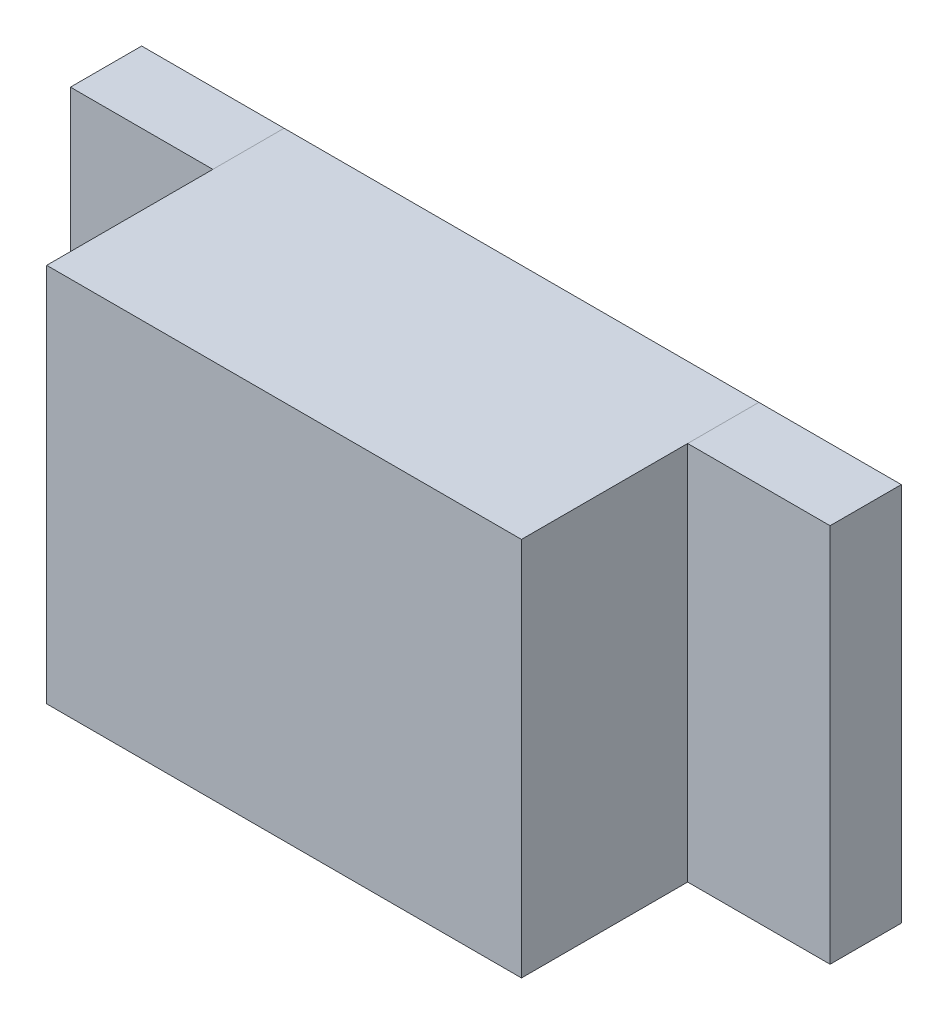
ISO-10303-21;
HEADER;
FILE_DESCRIPTION(('STEP AP214'),'2;1');
FILE_NAME('part.step','',(''),(''),'','','');
FILE_SCHEMA(('AUTOMOTIVE_DESIGN { 1 0 10303 214 1 1 1 1 }'));
ENDSEC;
DATA;
#1=APPLICATION_CONTEXT('core data for automotive mechanical design processes');
#2=APPLICATION_PROTOCOL_DEFINITION('international standard','automotive_design',2000,#1);
#3=PRODUCT_CONTEXT('',#1,'mechanical');
#4=PRODUCT('Part','Part','',(#3));
#5=PRODUCT_RELATED_PRODUCT_CATEGORY('part','',(#4));
#6=PRODUCT_DEFINITION_FORMATION('','',#4);
#7=PRODUCT_DEFINITION_CONTEXT('part definition',#1,'design');
#8=PRODUCT_DEFINITION('design','',#6,#7);
#9=PRODUCT_DEFINITION_SHAPE('','',#8);
#10=(LENGTH_UNIT() NAMED_UNIT(*) SI_UNIT(.MILLI.,.METRE.));
#11=(NAMED_UNIT(*) PLANE_ANGLE_UNIT() SI_UNIT($,.RADIAN.));
#12=(NAMED_UNIT(*) SI_UNIT($,.STERADIAN.) SOLID_ANGLE_UNIT());
#13=UNCERTAINTY_MEASURE_WITH_UNIT(LENGTH_MEASURE(1.E-05),#10,'distance_accuracy_value','');
#14=(GEOMETRIC_REPRESENTATION_CONTEXT(3) GLOBAL_UNCERTAINTY_ASSIGNED_CONTEXT((#13)) GLOBAL_UNIT_ASSIGNED_CONTEXT((#10,
#11,#12)) REPRESENTATION_CONTEXT('',''));
#15=CARTESIAN_POINT('',(0.,0.,0.));
#16=DIRECTION('',(0.,0.,1.));
#17=DIRECTION('',(1.,0.,0.));
#18=AXIS2_PLACEMENT_3D('',#15,#16,#17);
#19=CARTESIAN_POINT('',(0.80000094,-0.3999992,0.));
#20=DIRECTION('',(0.,-1.,0.));
#21=DIRECTION('',(-1.,0.,0.));
#22=AXIS2_PLACEMENT_3D('',#19,#20,#21);
#23=PLANE('',#22);
#24=DIRECTION('',(0.,0.,1.));
#25=VECTOR('',#24,1.);
#26=CARTESIAN_POINT('',(0.80000094,-0.3999992,0.));
#27=LINE('',#26,#25);
#28=CARTESIAN_POINT('',(0.80000094,-0.3999992,0.));
#29=VERTEX_POINT('',#28);
#30=CARTESIAN_POINT('',(0.80000094,-0.3999992,0.1499997));
#31=VERTEX_POINT('',#30);
#32=EDGE_CURVE('P0_E10',#29,#31,#27,.T.);
#33=ORIENTED_EDGE('',*,*,#32,.T.);
#34=DIRECTION('',(-1.,0.,0.));
#35=VECTOR('',#34,1.);
#36=CARTESIAN_POINT('',(0.80000094,-0.3999992,0.1499997));
#37=LINE('',#36,#35);
#38=CARTESIAN_POINT('',(-0.80000094,-0.3999992,0.1499997));
#39=VERTEX_POINT('',#38);
#40=EDGE_CURVE('P0_E23',#31,#39,#37,.T.);
#41=ORIENTED_EDGE('',*,*,#40,.T.);
#42=DIRECTION('',(0.,0.,1.));
#43=VECTOR('',#42,1.);
#44=CARTESIAN_POINT('',(-0.80000094,-0.3999992,0.));
#45=LINE('',#44,#43);
#46=CARTESIAN_POINT('',(-0.80000094,-0.3999992,0.));
#47=VERTEX_POINT('',#46);
#48=EDGE_CURVE('P0_E84',#47,#39,#45,.T.);
#49=ORIENTED_EDGE('',*,*,#48,.F.);
#50=DIRECTION('',(-1.,0.,0.));
#51=VECTOR('',#50,1.);
#52=CARTESIAN_POINT('',(0.80000094,-0.3999992,0.));
#53=LINE('',#52,#51);
#54=EDGE_CURVE('P0_E82',#29,#47,#53,.T.);
#55=ORIENTED_EDGE('',*,*,#54,.F.);
#56=EDGE_LOOP('',(#33,#41,#49,#55));
#57=FACE_BOUND('',#56,.T.);
#58=ADVANCED_FACE('P0_F16',(#57),#23,.T.);
#59=CARTESIAN_POINT('',(-0.80000094,-0.3999992,0.));
#60=DIRECTION('',(-1.,0.,0.));
#61=DIRECTION('',(0.,1.,0.));
#62=AXIS2_PLACEMENT_3D('',#59,#60,#61);
#63=PLANE('',#62);
#64=ORIENTED_EDGE('',*,*,#48,.T.);
#65=DIRECTION('',(0.,1.,0.));
#66=VECTOR('',#65,1.);
#67=CARTESIAN_POINT('',(-0.80000094,-0.3999992,0.1499997));
#68=LINE('',#67,#66);
#69=CARTESIAN_POINT('',(-0.80000094,0.3999992,0.1499997));
#70=VERTEX_POINT('',#69);
#71=EDGE_CURVE('P0_E80',#39,#70,#68,.T.);
#72=ORIENTED_EDGE('',*,*,#71,.T.);
#73=DIRECTION('',(0.,0.,1.));
#74=VECTOR('',#73,1.);
#75=CARTESIAN_POINT('',(-0.80000094,0.3999992,0.));
#76=LINE('',#75,#74);
#77=CARTESIAN_POINT('',(-0.80000094,0.3999992,0.));
#78=VERTEX_POINT('',#77);
#79=EDGE_CURVE('P0_E78',#78,#70,#76,.T.);
#80=ORIENTED_EDGE('',*,*,#79,.F.);
#81=DIRECTION('',(0.,1.,0.));
#82=VECTOR('',#81,1.);
#83=CARTESIAN_POINT('',(-0.80000094,-0.3999992,0.));
#84=LINE('',#83,#82);
#85=EDGE_CURVE('P0_E69',#47,#78,#84,.T.);
#86=ORIENTED_EDGE('',*,*,#85,.F.);
#87=EDGE_LOOP('',(#64,#72,#80,#86));
#88=FACE_BOUND('',#87,.T.);
#89=ADVANCED_FACE('P0_F89',(#88),#63,.T.);
#90=CARTESIAN_POINT('',(-0.80000094,0.3999992,0.));
#91=DIRECTION('',(0.,1.,0.));
#92=DIRECTION('',(1.,0.,0.));
#93=AXIS2_PLACEMENT_3D('',#90,#91,#92);
#94=PLANE('',#93);
#95=ORIENTED_EDGE('',*,*,#79,.T.);
#96=DIRECTION('',(1.,0.,0.));
#97=VECTOR('',#96,1.);
#98=CARTESIAN_POINT('',(-0.80000094,0.3999992,0.1499997));
#99=LINE('',#98,#97);
#100=CARTESIAN_POINT('',(0.80000094,0.3999992,0.1499997));
#101=VERTEX_POINT('',#100);
#102=EDGE_CURVE('P0_E59',#70,#101,#99,.T.);
#103=ORIENTED_EDGE('',*,*,#102,.T.);
#104=DIRECTION('',(0.,0.,1.));
#105=VECTOR('',#104,1.);
#106=CARTESIAN_POINT('',(0.80000094,0.3999992,0.));
#107=LINE('',#106,#105);
#108=CARTESIAN_POINT('',(0.80000094,0.3999992,0.));
#109=VERTEX_POINT('',#108);
#110=EDGE_CURVE('P0_E53',#109,#101,#107,.T.);
#111=ORIENTED_EDGE('',*,*,#110,.F.);
#112=DIRECTION('',(1.,0.,0.));
#113=VECTOR('',#112,1.);
#114=CARTESIAN_POINT('',(-0.80000094,0.3999992,0.));
#115=LINE('',#114,#113);
#116=EDGE_CURVE('P0_E57',#78,#109,#115,.T.);
#117=ORIENTED_EDGE('',*,*,#116,.F.);
#118=EDGE_LOOP('',(#95,#103,#111,#117));
#119=FACE_BOUND('',#118,.T.);
#120=ADVANCED_FACE('P0_F56',(#119),#94,.T.);
#121=CARTESIAN_POINT('',(0.80000094,0.3999992,0.));
#122=DIRECTION('',(1.,0.,0.));
#123=DIRECTION('',(0.,-1.,0.));
#124=AXIS2_PLACEMENT_3D('',#121,#122,#123);
#125=PLANE('',#124);
#126=ORIENTED_EDGE('',*,*,#110,.T.);
#127=DIRECTION('',(0.,-1.,0.));
#128=VECTOR('',#127,1.);
#129=CARTESIAN_POINT('',(0.80000094,0.3999992,0.1499997));
#130=LINE('',#129,#128);
#131=EDGE_CURVE('P0_E70',#101,#31,#130,.T.);
#132=ORIENTED_EDGE('',*,*,#131,.T.);
#133=ORIENTED_EDGE('',*,*,#32,.F.);
#134=DIRECTION('',(0.,-1.,0.));
#135=VECTOR('',#134,1.);
#136=CARTESIAN_POINT('',(0.80000094,0.3999992,0.));
#137=LINE('',#136,#135);
#138=EDGE_CURVE('P0_E67',#109,#29,#137,.T.);
#139=ORIENTED_EDGE('',*,*,#138,.F.);
#140=EDGE_LOOP('',(#126,#132,#133,#139));
#141=FACE_BOUND('',#140,.T.);
#142=ADVANCED_FACE('P0_F72',(#141),#125,.T.);
#143=CARTESIAN_POINT('',(0.,0.,0.));
#144=DIRECTION('',(0.,0.,-1.));
#145=DIRECTION('',(0.,1.,0.));
#146=AXIS2_PLACEMENT_3D('',#143,#144,#145);
#147=PLANE('',#146);
#148=ORIENTED_EDGE('',*,*,#54,.T.);
#149=ORIENTED_EDGE('',*,*,#85,.T.);
#150=ORIENTED_EDGE('',*,*,#116,.T.);
#151=ORIENTED_EDGE('',*,*,#138,.T.);
#152=EDGE_LOOP('',(#148,#149,#150,#151));
#153=FACE_BOUND('',#152,.T.);
#154=ADVANCED_FACE('P0_F66',(#153),#147,.T.);
#155=CARTESIAN_POINT('',(0.,0.,0.1499997));
#156=DIRECTION('',(0.,0.,-1.));
#157=DIRECTION('',(0.,1.,0.));
#158=AXIS2_PLACEMENT_3D('',#155,#156,#157);
#159=PLANE('',#158);
#160=ORIENTED_EDGE('',*,*,#131,.F.);
#161=ORIENTED_EDGE('',*,*,#102,.F.);
#162=ORIENTED_EDGE('',*,*,#71,.F.);
#163=ORIENTED_EDGE('',*,*,#40,.F.);
#164=EDGE_LOOP('',(#160,#161,#162,#163));
#165=FACE_BOUND('',#164,.T.);
#166=ADVANCED_FACE('P0_F90',(#165),#159,.F.);
#167=CLOSED_SHELL('',(#58,#89,#120,#142,#154,#166));
#168=MANIFOLD_SOLID_BREP('P0_B1',#167);
#169=CARTESIAN_POINT('',(0.499999,0.3999992,0.));
#170=DIRECTION('',(0.,-1.,0.));
#171=DIRECTION('',(-1.,0.,0.));
#172=AXIS2_PLACEMENT_3D('',#169,#170,#171);
#173=PLANE('',#172);
#174=DIRECTION('',(-1.,0.,0.));
#175=VECTOR('',#174,1.);
#176=CARTESIAN_POINT('',(0.499999,0.3999992,0.));
#177=LINE('',#176,#175);
#178=CARTESIAN_POINT('',(0.499999,0.3999992,0.));
#179=VERTEX_POINT('',#178);
#180=CARTESIAN_POINT('',(-0.499999,0.3999992,0.));
#181=VERTEX_POINT('',#180);
#182=EDGE_CURVE('P1_E10',#179,#181,#177,.T.);
#183=ORIENTED_EDGE('',*,*,#182,.T.);
#184=DIRECTION('',(0.,0.,1.));
#185=VECTOR('',#184,1.);
#186=CARTESIAN_POINT('',(-0.499999,0.3999992,0.));
#187=LINE('',#186,#185);
#188=CARTESIAN_POINT('',(-0.499999,0.3999992,0.499999));
#189=VERTEX_POINT('',#188);
#190=EDGE_CURVE('P1_E23',#181,#189,#187,.T.);
#191=ORIENTED_EDGE('',*,*,#190,.T.);
#192=DIRECTION('',(-1.,0.,0.));
#193=VECTOR('',#192,1.);
#194=CARTESIAN_POINT('',(0.499999,0.3999992,0.499999));
#195=LINE('',#194,#193);
#196=CARTESIAN_POINT('',(0.499999,0.3999992,0.499999));
#197=VERTEX_POINT('',#196);
#198=EDGE_CURVE('P1_E86',#197,#189,#195,.T.);
#199=ORIENTED_EDGE('',*,*,#198,.F.);
#200=DIRECTION('',(0.,0.,1.));
#201=VECTOR('',#200,1.);
#202=CARTESIAN_POINT('',(0.499999,0.3999992,0.));
#203=LINE('',#202,#201);
#204=EDGE_CURVE('P1_E35',#179,#197,#203,.T.);
#205=ORIENTED_EDGE('',*,*,#204,.F.);
#206=EDGE_LOOP('',(#183,#191,#199,#205));
#207=FACE_BOUND('',#206,.T.);
#208=ADVANCED_FACE('P1_F16',(#207),#173,.F.);
#209=CARTESIAN_POINT('',(-0.499999,0.3999992,0.));
#210=DIRECTION('',(1.,0.,0.));
#211=DIRECTION('',(0.,-1.,0.));
#212=AXIS2_PLACEMENT_3D('',#209,#210,#211);
#213=PLANE('',#212);
#214=DIRECTION('',(0.,-1.,0.));
#215=VECTOR('',#214,1.);
#216=CARTESIAN_POINT('',(-0.499999,0.3999992,0.));
#217=LINE('',#216,#215);
#218=CARTESIAN_POINT('',(-0.499999,-0.3999992,0.));
#219=VERTEX_POINT('',#218);
#220=EDGE_CURVE('P1_E83',#181,#219,#217,.T.);
#221=ORIENTED_EDGE('',*,*,#220,.T.);
#222=DIRECTION('',(0.,0.,1.));
#223=VECTOR('',#222,1.);
#224=CARTESIAN_POINT('',(-0.499999,-0.3999992,0.));
#225=LINE('',#224,#223);
#226=CARTESIAN_POINT('',(-0.499999,-0.3999992,0.499999));
#227=VERTEX_POINT('',#226);
#228=EDGE_CURVE('P1_E81',#219,#227,#225,.T.);
#229=ORIENTED_EDGE('',*,*,#228,.T.);
#230=DIRECTION('',(0.,-1.,0.));
#231=VECTOR('',#230,1.);
#232=CARTESIAN_POINT('',(-0.499999,0.3999992,0.499999));
#233=LINE('',#232,#231);
#234=EDGE_CURVE('P1_E61',#189,#227,#233,.T.);
#235=ORIENTED_EDGE('',*,*,#234,.F.);
#236=ORIENTED_EDGE('',*,*,#190,.F.);
#237=EDGE_LOOP('',(#221,#229,#235,#236));
#238=FACE_BOUND('',#237,.T.);
#239=ADVANCED_FACE('P1_F88',(#238),#213,.F.);
#240=CARTESIAN_POINT('',(-0.499999,-0.3999992,0.));
#241=DIRECTION('',(0.,1.,0.));
#242=DIRECTION('',(1.,0.,0.));
#243=AXIS2_PLACEMENT_3D('',#240,#241,#242);
#244=PLANE('',#243);
#245=DIRECTION('',(1.,0.,0.));
#246=VECTOR('',#245,1.);
#247=CARTESIAN_POINT('',(-0.499999,-0.3999992,0.));
#248=LINE('',#247,#246);
#249=CARTESIAN_POINT('',(0.499999,-0.3999992,0.));
#250=VERTEX_POINT('',#249);
#251=EDGE_CURVE('P1_E70',#219,#250,#248,.T.);
#252=ORIENTED_EDGE('',*,*,#251,.T.);
#253=DIRECTION('',(0.,0.,1.));
#254=VECTOR('',#253,1.);
#255=CARTESIAN_POINT('',(0.499999,-0.3999992,0.));
#256=LINE('',#255,#254);
#257=CARTESIAN_POINT('',(0.499999,-0.3999992,0.499999));
#258=VERTEX_POINT('',#257);
#259=EDGE_CURVE('P1_E64',#250,#258,#256,.T.);
#260=ORIENTED_EDGE('',*,*,#259,.T.);
#261=DIRECTION('',(1.,0.,0.));
#262=VECTOR('',#261,1.);
#263=CARTESIAN_POINT('',(-0.499999,-0.3999992,0.499999));
#264=LINE('',#263,#262);
#265=EDGE_CURVE('P1_E56',#227,#258,#264,.T.);
#266=ORIENTED_EDGE('',*,*,#265,.F.);
#267=ORIENTED_EDGE('',*,*,#228,.F.);
#268=EDGE_LOOP('',(#252,#260,#266,#267));
#269=FACE_BOUND('',#268,.T.);
#270=ADVANCED_FACE('P1_F68',(#269),#244,.F.);
#271=CARTESIAN_POINT('',(0.499999,-0.3999992,0.));
#272=DIRECTION('',(-1.,0.,0.));
#273=DIRECTION('',(0.,1.,0.));
#274=AXIS2_PLACEMENT_3D('',#271,#272,#273);
#275=PLANE('',#274);
#276=DIRECTION('',(0.,1.,0.));
#277=VECTOR('',#276,1.);
#278=CARTESIAN_POINT('',(0.499999,-0.3999992,0.));
#279=LINE('',#278,#277);
#280=EDGE_CURVE('P1_E65',#250,#179,#279,.T.);
#281=ORIENTED_EDGE('',*,*,#280,.T.);
#282=ORIENTED_EDGE('',*,*,#204,.T.);
#283=DIRECTION('',(0.,1.,0.));
#284=VECTOR('',#283,1.);
#285=CARTESIAN_POINT('',(0.499999,-0.3999992,0.499999));
#286=LINE('',#285,#284);
#287=EDGE_CURVE('P1_E60',#258,#197,#286,.T.);
#288=ORIENTED_EDGE('',*,*,#287,.F.);
#289=ORIENTED_EDGE('',*,*,#259,.F.);
#290=EDGE_LOOP('',(#281,#282,#288,#289));
#291=FACE_BOUND('',#290,.T.);
#292=ADVANCED_FACE('P1_F75',(#291),#275,.F.);
#293=CARTESIAN_POINT('',(0.,0.,0.));
#294=DIRECTION('',(0.,0.,1.));
#295=DIRECTION('',(0.,-1.,0.));
#296=AXIS2_PLACEMENT_3D('',#293,#294,#295);
#297=PLANE('',#296);
#298=ORIENTED_EDGE('',*,*,#280,.F.);
#299=ORIENTED_EDGE('',*,*,#251,.F.);
#300=ORIENTED_EDGE('',*,*,#220,.F.);
#301=ORIENTED_EDGE('',*,*,#182,.F.);
#302=EDGE_LOOP('',(#298,#299,#300,#301));
#303=FACE_BOUND('',#302,.T.);
#304=ADVANCED_FACE('P1_F90',(#303),#297,.F.);
#305=CARTESIAN_POINT('',(0.,0.,0.499999));
#306=DIRECTION('',(0.,0.,1.));
#307=DIRECTION('',(0.,-1.,0.));
#308=AXIS2_PLACEMENT_3D('',#305,#306,#307);
#309=PLANE('',#308);
#310=ORIENTED_EDGE('',*,*,#198,.T.);
#311=ORIENTED_EDGE('',*,*,#234,.T.);
#312=ORIENTED_EDGE('',*,*,#265,.T.);
#313=ORIENTED_EDGE('',*,*,#287,.T.);
#314=EDGE_LOOP('',(#310,#311,#312,#313));
#315=FACE_BOUND('',#314,.T.);
#316=ADVANCED_FACE('P1_F58',(#315),#309,.T.);
#317=CLOSED_SHELL('',(#208,#239,#270,#292,#304,#316));
#318=MANIFOLD_SOLID_BREP('P1_B1',#317);
#319=ADVANCED_BREP_SHAPE_REPRESENTATION('',(#18,#168,#318),#14);
#320=SHAPE_DEFINITION_REPRESENTATION(#9,#319);
ENDSEC;
END-ISO-10303-21;
